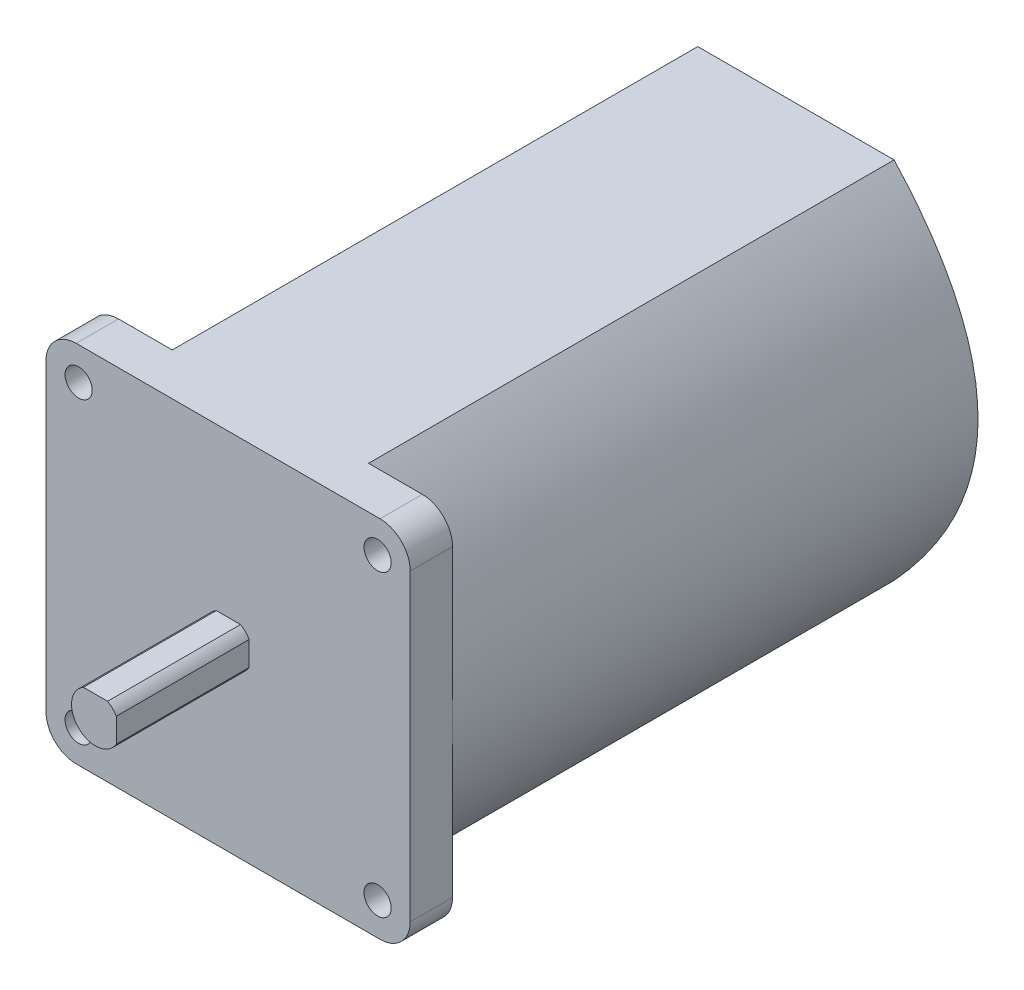
ISO-10303-21;
HEADER;
FILE_DESCRIPTION(('STEP AP214'),'2;1');
FILE_NAME('part.step','',(''),(''),'','','');
FILE_SCHEMA(('AUTOMOTIVE_DESIGN { 1 0 10303 214 1 1 1 1 }'));
ENDSEC;
DATA;
#1=APPLICATION_CONTEXT('core data for automotive mechanical design processes');
#2=APPLICATION_PROTOCOL_DEFINITION('international standard','automotive_design',2000,#1);
#3=PRODUCT_CONTEXT('',#1,'mechanical');
#4=PRODUCT('Part','Part','',(#3));
#5=PRODUCT_RELATED_PRODUCT_CATEGORY('part','',(#4));
#6=PRODUCT_DEFINITION_FORMATION('','',#4);
#7=PRODUCT_DEFINITION_CONTEXT('part definition',#1,'design');
#8=PRODUCT_DEFINITION('design','',#6,#7);
#9=PRODUCT_DEFINITION_SHAPE('','',#8);
#10=(LENGTH_UNIT() NAMED_UNIT(*) SI_UNIT(.MILLI.,.METRE.));
#11=(NAMED_UNIT(*) PLANE_ANGLE_UNIT() SI_UNIT($,.RADIAN.));
#12=(NAMED_UNIT(*) SI_UNIT($,.STERADIAN.) SOLID_ANGLE_UNIT());
#13=UNCERTAINTY_MEASURE_WITH_UNIT(LENGTH_MEASURE(1.E-05),#10,'distance_accuracy_value','');
#14=(GEOMETRIC_REPRESENTATION_CONTEXT(3) GLOBAL_UNCERTAINTY_ASSIGNED_CONTEXT((#13)) GLOBAL_UNIT_ASSIGNED_CONTEXT((#10,
#11,#12)) REPRESENTATION_CONTEXT('',''));
#15=CARTESIAN_POINT('',(0.,0.,0.));
#16=DIRECTION('',(0.,0.,1.));
#17=DIRECTION('',(1.,0.,0.));
#18=AXIS2_PLACEMENT_3D('',#15,#16,#17);
#19=CARTESIAN_POINT('',(-8.9,4.99999999999999,94.));
#20=DIRECTION('',(0.,0.,-1.));
#21=DIRECTION('',(-1.,0.,0.));
#22=AXIS2_PLACEMENT_3D('',#19,#20,#21);
#23=PLANE('',#22);
#24=CARTESIAN_POINT('',(-8.49873734152981,54.8987373415292,94.));
#25=DIRECTION('',(0.,0.,1.));
#26=DIRECTION('',(1.,0.,0.));
#27=AXIS2_PLACEMENT_3D('',#24,#25,#26);
#28=CIRCLE('',#27,2.24999999999927);
#29=CARTESIAN_POINT('',(-6.24873734153054,54.8987373415292,94.));
#30=VERTEX_POINT('',#29);
#31=EDGE_CURVE('E179',#30,#30,#28,.T.);
#32=ORIENTED_EDGE('',*,*,#31,.F.);
#33=EDGE_LOOP('',(#32));
#34=FACE_BOUND('',#33,.T.);
#35=CARTESIAN_POINT('',(40.9987373415298,5.40126265847079,94.));
#36=DIRECTION('',(0.,0.,1.));
#37=DIRECTION('',(1.,0.,0.));
#38=AXIS2_PLACEMENT_3D('',#35,#36,#37);
#39=CIRCLE('',#38,2.25);
#40=CARTESIAN_POINT('',(43.2487373415298,5.40126265847079,94.));
#41=VERTEX_POINT('',#40);
#42=EDGE_CURVE('E194',#41,#41,#39,.T.);
#43=ORIENTED_EDGE('',*,*,#42,.F.);
#44=EDGE_LOOP('',(#43));
#45=FACE_BOUND('',#44,.T.);
#46=CARTESIAN_POINT('',(-8.9,4.99999999999999,94.));
#47=DIRECTION('',(0.,0.,1.));
#48=DIRECTION('',(-1.,0.,0.));
#49=AXIS2_PLACEMENT_3D('',#46,#47,#48);
#50=CIRCLE('',#49,5.);
#51=CARTESIAN_POINT('',(-13.9,5.00000000000003,94.));
#52=VERTEX_POINT('',#51);
#53=CARTESIAN_POINT('',(-8.89999999999996,0.,94.));
#54=VERTEX_POINT('',#53);
#55=EDGE_CURVE('E206',#52,#54,#50,.T.);
#56=ORIENTED_EDGE('',*,*,#55,.T.);
#57=DIRECTION('',(1.,0.,0.));
#58=VECTOR('',#57,1.);
#59=CARTESIAN_POINT('',(41.4,0.,94.));
#60=LINE('',#59,#58);
#61=CARTESIAN_POINT('',(41.4,0.,94.));
#62=VERTEX_POINT('',#61);
#63=EDGE_CURVE('E209',#54,#62,#60,.T.);
#64=ORIENTED_EDGE('',*,*,#63,.T.);
#65=CARTESIAN_POINT('',(41.4,5.,94.));
#66=DIRECTION('',(0.,0.,1.));
#67=DIRECTION('',(-1.,0.,0.));
#68=AXIS2_PLACEMENT_3D('',#65,#66,#67);
#69=CIRCLE('',#68,5.);
#70=CARTESIAN_POINT('',(46.4,5.00000000000004,94.));
#71=VERTEX_POINT('',#70);
#72=EDGE_CURVE('E212',#62,#71,#69,.T.);
#73=ORIENTED_EDGE('',*,*,#72,.T.);
#74=DIRECTION('',(0.,1.,0.));
#75=VECTOR('',#74,1.);
#76=CARTESIAN_POINT('',(46.4,55.2999999999998,94.));
#77=LINE('',#76,#75);
#78=CARTESIAN_POINT('',(46.4,55.2999999999998,94.));
#79=VERTEX_POINT('',#78);
#80=EDGE_CURVE('E214',#71,#79,#77,.T.);
#81=ORIENTED_EDGE('',*,*,#80,.T.);
#82=CARTESIAN_POINT('',(41.4,55.2999999999999,94.));
#83=DIRECTION('',(0.,0.,1.));
#84=DIRECTION('',(-1.,0.,0.));
#85=AXIS2_PLACEMENT_3D('',#82,#83,#84);
#86=CIRCLE('',#85,5.);
#87=CARTESIAN_POINT('',(41.3999999999999,60.2999999999999,94.));
#88=VERTEX_POINT('',#87);
#89=EDGE_CURVE('E216',#79,#88,#86,.T.);
#90=ORIENTED_EDGE('',*,*,#89,.T.);
#91=DIRECTION('',(-1.,0.,0.));
#92=VECTOR('',#91,1.);
#93=CARTESIAN_POINT('',(-8.89999999999997,60.2999999999999,94.));
#94=LINE('',#93,#92);
#95=CARTESIAN_POINT('',(-8.89999999999997,60.2999999999999,94.));
#96=VERTEX_POINT('',#95);
#97=EDGE_CURVE('E218',#88,#96,#94,.T.);
#98=ORIENTED_EDGE('',*,*,#97,.T.);
#99=CARTESIAN_POINT('',(-8.90000000000001,55.2999999999999,94.));
#100=DIRECTION('',(0.,0.,1.));
#101=DIRECTION('',(-1.,0.,0.));
#102=AXIS2_PLACEMENT_3D('',#99,#100,#101);
#103=CIRCLE('',#102,5.);
#104=CARTESIAN_POINT('',(-13.9,55.2999999999998,94.));
#105=VERTEX_POINT('',#104);
#106=EDGE_CURVE('E220',#96,#105,#103,.T.);
#107=ORIENTED_EDGE('',*,*,#106,.T.);
#108=DIRECTION('',(0.,-1.,0.));
#109=VECTOR('',#108,1.);
#110=CARTESIAN_POINT('',(-13.9,55.2999999999998,94.));
#111=LINE('',#110,#109);
#112=EDGE_CURVE('E222',#105,#52,#111,.T.);
#113=ORIENTED_EDGE('',*,*,#112,.T.);
#114=EDGE_LOOP('',(#56,#64,#73,#81,#90,#98,#107,#113));
#115=FACE_BOUND('',#114,.T.);
#116=CARTESIAN_POINT('',(40.9987373415291,54.8987373415292,94.));
#117=DIRECTION('',(0.,0.,1.));
#118=DIRECTION('',(1.,0.,0.));
#119=AXIS2_PLACEMENT_3D('',#116,#117,#118);
#120=CIRCLE('',#119,2.25);
#121=CARTESIAN_POINT('',(43.2487373415291,54.8987373415292,94.));
#122=VERTEX_POINT('',#121);
#123=EDGE_CURVE('E200',#122,#122,#120,.T.);
#124=ORIENTED_EDGE('',*,*,#123,.F.);
#125=EDGE_LOOP('',(#124));
#126=FACE_BOUND('',#125,.T.);
#127=CARTESIAN_POINT('',(-8.4987373415286,5.40126265847027,94.));
#128=DIRECTION('',(0.,0.,1.));
#129=DIRECTION('',(1.,0.,0.));
#130=AXIS2_PLACEMENT_3D('',#127,#128,#129);
#131=CIRCLE('',#130,2.25000000000001);
#132=CARTESIAN_POINT('',(-6.2487373415286,5.40126265847027,94.));
#133=VERTEX_POINT('',#132);
#134=EDGE_CURVE('E188',#133,#133,#131,.T.);
#135=ORIENTED_EDGE('',*,*,#134,.F.);
#136=EDGE_LOOP('',(#135));
#137=FACE_BOUND('',#136,.T.);
#138=CARTESIAN_POINT('',(16.3001335088736,30.15,94.));
#139=DIRECTION('',(0.,0.,1.));
#140=DIRECTION('',(-1.,0.,0.));
#141=AXIS2_PLACEMENT_3D('',#138,#139,#140);
#142=CIRCLE('',#141,3.9749999999999);
#143=CARTESIAN_POINT('',(19.7353372873996,32.1499999999999,94.));
#144=VERTEX_POINT('',#143);
#145=CARTESIAN_POINT('',(18.3001335088735,33.585203778526,94.));
#146=VERTEX_POINT('',#145);
#147=EDGE_CURVE('E175',#144,#146,#142,.T.);
#148=ORIENTED_EDGE('',*,*,#147,.F.);
#149=DIRECTION('',(0.,1.,0.));
#150=VECTOR('',#149,1.);
#151=CARTESIAN_POINT('',(19.7353372873996,32.1499999999999,94.));
#152=LINE('',#151,#150);
#153=CARTESIAN_POINT('',(19.7353372873996,28.1499999999999,94.));
#154=VERTEX_POINT('',#153);
#155=EDGE_CURVE('E172',#154,#144,#152,.T.);
#156=ORIENTED_EDGE('',*,*,#155,.F.);
#157=CARTESIAN_POINT('',(16.3001335088735,30.1499999999999,94.));
#158=DIRECTION('',(0.,0.,1.));
#159=DIRECTION('',(1.,0.,0.));
#160=AXIS2_PLACEMENT_3D('',#157,#158,#159);
#161=CIRCLE('',#160,3.975);
#162=CARTESIAN_POINT('',(14.3001335088735,33.585203778526,94.));
#163=VERTEX_POINT('',#162);
#164=EDGE_CURVE('E56',#163,#154,#161,.T.);
#165=ORIENTED_EDGE('',*,*,#164,.F.);
#166=DIRECTION('',(-1.,0.,0.));
#167=VECTOR('',#166,1.);
#168=CARTESIAN_POINT('',(18.3001335088735,33.585203778526,94.));
#169=LINE('',#168,#167);
#170=EDGE_CURVE('E51',#146,#163,#169,.T.);
#171=ORIENTED_EDGE('',*,*,#170,.F.);
#172=EDGE_LOOP('',(#148,#156,#165,#171));
#173=FACE_BOUND('',#172,.T.);
#174=ADVANCED_FACE('F33',(#34,#45,#115,#126,#137,#173),#23,.F.);
#175=CARTESIAN_POINT('',(0.,60.3,87.));
#176=CARTESIAN_POINT('',(-27.8,30.15,87.));
#177=CARTESIAN_POINT('',(0.,0.,87.));
#178=B_SPLINE_CURVE_WITH_KNOTS('',2,(#175,#176,#177),.UNSPECIFIED.,.F.,.F.,(3,3),(0.,1.),.UNSPECIFIED.);
#179=DIRECTION('',(0.,0.,-1.));
#180=VECTOR('',#179,1.);
#181=SURFACE_OF_LINEAR_EXTRUSION('',#178,#180);
#182=CARTESIAN_POINT('',(0.,60.3,0.));
#183=CARTESIAN_POINT('',(-27.8,30.15,0.));
#184=CARTESIAN_POINT('',(0.,0.,0.));
#185=B_SPLINE_CURVE_WITH_KNOTS('',2,(#182,#183,#184),.UNSPECIFIED.,.F.,.F.,(3,3),(0.,1.),.UNSPECIFIED.);
#186=CARTESIAN_POINT('',(0.,60.3,0.));
#187=VERTEX_POINT('',#186);
#188=CARTESIAN_POINT('',(0.,0.,0.));
#189=VERTEX_POINT('',#188);
#190=EDGE_CURVE('E274',#187,#189,#185,.T.);
#191=ORIENTED_EDGE('',*,*,#190,.T.);
#192=DIRECTION('',(0.,0.,-1.));
#193=VECTOR('',#192,1.);
#194=CARTESIAN_POINT('',(0.,0.,87.));
#195=LINE('',#194,#193);
#196=CARTESIAN_POINT('',(0.,0.,87.));
#197=VERTEX_POINT('',#196);
#198=EDGE_CURVE('E11',#197,#189,#195,.T.);
#199=ORIENTED_EDGE('',*,*,#198,.F.);
#200=CARTESIAN_POINT('',(-13.9,30.149999999998,87.));
#201=VERTEX_POINT('',#200);
#202=EDGE_CURVE('E303',#201,#197,#178,.T.);
#203=ORIENTED_EDGE('',*,*,#202,.F.);
#204=CARTESIAN_POINT('',(0.,60.3,87.));
#205=VERTEX_POINT('',#204);
#206=EDGE_CURVE('E38',#205,#201,#178,.T.);
#207=ORIENTED_EDGE('',*,*,#206,.F.);
#208=DIRECTION('',(0.,0.,-1.));
#209=VECTOR('',#208,1.);
#210=CARTESIAN_POINT('',(0.,60.3,87.));
#211=LINE('',#210,#209);
#212=EDGE_CURVE('E307',#205,#187,#211,.T.);
#213=ORIENTED_EDGE('',*,*,#212,.T.);
#214=EDGE_LOOP('',(#191,#199,#203,#207,#213));
#215=FACE_BOUND('',#214,.T.);
#216=ADVANCED_FACE('F35',(#215),#181,.F.);
#217=CARTESIAN_POINT('',(0.,0.,87.));
#218=DIRECTION('',(0.,1.,0.));
#219=DIRECTION('',(0.,0.,1.));
#220=AXIS2_PLACEMENT_3D('',#217,#218,#219);
#221=PLANE('',#220);
#222=DIRECTION('',(1.,0.,0.));
#223=VECTOR('',#222,1.);
#224=CARTESIAN_POINT('',(0.,0.,0.));
#225=LINE('',#224,#223);
#226=CARTESIAN_POINT('',(32.5,0.,0.));
#227=VERTEX_POINT('',#226);
#228=EDGE_CURVE('E278',#189,#227,#225,.T.);
#229=ORIENTED_EDGE('',*,*,#228,.T.);
#230=DIRECTION('',(0.,0.,-1.));
#231=VECTOR('',#230,1.);
#232=CARTESIAN_POINT('',(32.5,0.,87.));
#233=LINE('',#232,#231);
#234=CARTESIAN_POINT('',(32.5,0.,87.));
#235=VERTEX_POINT('',#234);
#236=EDGE_CURVE('E43',#235,#227,#233,.T.);
#237=ORIENTED_EDGE('',*,*,#236,.F.);
#238=DIRECTION('',(1.,0.,0.));
#239=VECTOR('',#238,1.);
#240=CARTESIAN_POINT('',(41.4,0.,87.));
#241=LINE('',#240,#239);
#242=CARTESIAN_POINT('',(41.4,0.,87.));
#243=VERTEX_POINT('',#242);
#244=EDGE_CURVE('E227',#235,#243,#241,.T.);
#245=ORIENTED_EDGE('',*,*,#244,.T.);
#246=DIRECTION('',(0.,0.,-1.));
#247=VECTOR('',#246,1.);
#248=CARTESIAN_POINT('',(41.4,0.,94.));
#249=LINE('',#248,#247);
#250=EDGE_CURVE('E270',#62,#243,#249,.T.);
#251=ORIENTED_EDGE('',*,*,#250,.F.);
#252=ORIENTED_EDGE('',*,*,#63,.F.);
#253=DIRECTION('',(0.,0.,-1.));
#254=VECTOR('',#253,1.);
#255=CARTESIAN_POINT('',(-8.89999999999996,0.,94.));
#256=LINE('',#255,#254);
#257=CARTESIAN_POINT('',(-8.89999999999996,0.,87.));
#258=VERTEX_POINT('',#257);
#259=EDGE_CURVE('E272',#54,#258,#256,.T.);
#260=ORIENTED_EDGE('',*,*,#259,.T.);
#261=EDGE_CURVE('E235',#258,#197,#241,.T.);
#262=ORIENTED_EDGE('',*,*,#261,.T.);
#263=ORIENTED_EDGE('',*,*,#198,.T.);
#264=EDGE_LOOP('',(#229,#237,#245,#251,#252,#260,#262,#263));
#265=FACE_BOUND('',#264,.T.);
#266=ADVANCED_FACE('F341',(#265),#221,.F.);
#267=CARTESIAN_POINT('',(32.5,0.,87.));
#268=CARTESIAN_POINT('',(60.3,30.15,87.));
#269=CARTESIAN_POINT('',(32.5,60.3,87.));
#270=B_SPLINE_CURVE_WITH_KNOTS('',2,(#267,#268,#269),.UNSPECIFIED.,.F.,.F.,(3,3),(0.,1.),.UNSPECIFIED.);
#271=DIRECTION('',(0.,0.,-1.));
#272=VECTOR('',#271,1.);
#273=SURFACE_OF_LINEAR_EXTRUSION('',#270,#272);
#274=CARTESIAN_POINT('',(32.5,0.,0.));
#275=CARTESIAN_POINT('',(60.3,30.15,0.));
#276=CARTESIAN_POINT('',(32.5,60.3,0.));
#277=B_SPLINE_CURVE_WITH_KNOTS('',2,(#274,#275,#276),.UNSPECIFIED.,.F.,.F.,(3,3),(0.,1.),.UNSPECIFIED.);
#278=CARTESIAN_POINT('',(32.5,60.3,0.));
#279=VERTEX_POINT('',#278);
#280=EDGE_CURVE('E283',#227,#279,#277,.T.);
#281=ORIENTED_EDGE('',*,*,#280,.T.);
#282=DIRECTION('',(0.,0.,-1.));
#283=VECTOR('',#282,1.);
#284=CARTESIAN_POINT('',(32.5,60.3,87.));
#285=LINE('',#284,#283);
#286=CARTESIAN_POINT('',(32.5,60.2999999999999,87.));
#287=VERTEX_POINT('',#286);
#288=EDGE_CURVE('E304',#287,#279,#285,.T.);
#289=ORIENTED_EDGE('',*,*,#288,.F.);
#290=CARTESIAN_POINT('',(46.4,30.1500000000092,87.));
#291=VERTEX_POINT('',#290);
#292=EDGE_CURVE('E310',#291,#287,#270,.T.);
#293=ORIENTED_EDGE('',*,*,#292,.F.);
#294=EDGE_CURVE('E313',#235,#291,#270,.T.);
#295=ORIENTED_EDGE('',*,*,#294,.F.);
#296=ORIENTED_EDGE('',*,*,#236,.T.);
#297=EDGE_LOOP('',(#281,#289,#293,#295,#296));
#298=FACE_BOUND('',#297,.T.);
#299=ADVANCED_FACE('F376',(#298),#273,.F.);
#300=CARTESIAN_POINT('',(0.,60.3,87.));
#301=DIRECTION('',(0.,-1.,0.));
#302=DIRECTION('',(0.,0.,-1.));
#303=AXIS2_PLACEMENT_3D('',#300,#301,#302);
#304=PLANE('',#303);
#305=DIRECTION('',(-1.,0.,0.));
#306=VECTOR('',#305,1.);
#307=CARTESIAN_POINT('',(0.,60.3,0.));
#308=LINE('',#307,#306);
#309=EDGE_CURVE('E298',#279,#187,#308,.T.);
#310=ORIENTED_EDGE('',*,*,#309,.T.);
#311=ORIENTED_EDGE('',*,*,#212,.F.);
#312=DIRECTION('',(-1.,0.,0.));
#313=VECTOR('',#312,1.);
#314=CARTESIAN_POINT('',(-8.89999999999997,60.2999999999999,87.));
#315=LINE('',#314,#313);
#316=CARTESIAN_POINT('',(-8.89999999999997,60.2999999999999,87.));
#317=VERTEX_POINT('',#316);
#318=EDGE_CURVE('E238',#205,#317,#315,.T.);
#319=ORIENTED_EDGE('',*,*,#318,.T.);
#320=DIRECTION('',(0.,0.,-1.));
#321=VECTOR('',#320,1.);
#322=CARTESIAN_POINT('',(-8.89999999999997,60.2999999999999,94.));
#323=LINE('',#322,#321);
#324=EDGE_CURVE('E258',#96,#317,#323,.T.);
#325=ORIENTED_EDGE('',*,*,#324,.F.);
#326=ORIENTED_EDGE('',*,*,#97,.F.);
#327=DIRECTION('',(0.,0.,-1.));
#328=VECTOR('',#327,1.);
#329=CARTESIAN_POINT('',(41.3999999999999,60.2999999999999,94.));
#330=LINE('',#329,#328);
#331=CARTESIAN_POINT('',(41.3999999999999,60.2999999999999,87.));
#332=VERTEX_POINT('',#331);
#333=EDGE_CURVE('E261',#88,#332,#330,.T.);
#334=ORIENTED_EDGE('',*,*,#333,.T.);
#335=EDGE_CURVE('E241',#332,#287,#315,.T.);
#336=ORIENTED_EDGE('',*,*,#335,.T.);
#337=ORIENTED_EDGE('',*,*,#288,.T.);
#338=EDGE_LOOP('',(#310,#311,#319,#325,#326,#334,#336,#337));
#339=FACE_BOUND('',#338,.T.);
#340=ADVANCED_FACE('F356',(#339),#304,.F.);
#341=CARTESIAN_POINT('',(-13.9,30.15,0.));
#342=DIRECTION('',(0.,0.,-1.));
#343=DIRECTION('',(-1.,0.,0.));
#344=AXIS2_PLACEMENT_3D('',#341,#342,#343);
#345=PLANE('',#344);
#346=ORIENTED_EDGE('',*,*,#190,.F.);
#347=ORIENTED_EDGE('',*,*,#309,.F.);
#348=ORIENTED_EDGE('',*,*,#280,.F.);
#349=ORIENTED_EDGE('',*,*,#228,.F.);
#350=EDGE_LOOP('',(#346,#347,#348,#349));
#351=FACE_BOUND('',#350,.T.);
#352=ADVANCED_FACE('F339',(#351),#345,.T.);
#353=CARTESIAN_POINT('',(-8.9,4.99999999999999,87.));
#354=DIRECTION('',(0.,0.,-1.));
#355=DIRECTION('',(-1.,0.,0.));
#356=AXIS2_PLACEMENT_3D('',#353,#354,#355);
#357=PLANE('',#356);
#358=CARTESIAN_POINT('',(-8.49873734152981,54.8987373415292,87.));
#359=DIRECTION('',(0.,0.,1.));
#360=DIRECTION('',(1.,0.,0.));
#361=AXIS2_PLACEMENT_3D('',#358,#359,#360);
#362=CIRCLE('',#361,2.24999999999927);
#363=CARTESIAN_POINT('',(-6.24873734153054,54.8987373415292,87.));
#364=VERTEX_POINT('',#363);
#365=EDGE_CURVE('E176',#364,#364,#362,.T.);
#366=ORIENTED_EDGE('',*,*,#365,.T.);
#367=EDGE_LOOP('',(#366));
#368=FACE_BOUND('',#367,.T.);
#369=ORIENTED_EDGE('',*,*,#318,.F.);
#370=ORIENTED_EDGE('',*,*,#206,.T.);
#371=DIRECTION('',(0.,-1.,0.));
#372=VECTOR('',#371,1.);
#373=CARTESIAN_POINT('',(-13.9,55.2999999999998,87.));
#374=LINE('',#373,#372);
#375=CARTESIAN_POINT('',(-13.9,55.2999999999998,87.));
#376=VERTEX_POINT('',#375);
#377=EDGE_CURVE('E210',#376,#201,#374,.T.);
#378=ORIENTED_EDGE('',*,*,#377,.F.);
#379=CARTESIAN_POINT('',(-8.90000000000001,55.2999999999999,87.));
#380=DIRECTION('',(0.,0.,1.));
#381=DIRECTION('',(-1.,0.,0.));
#382=AXIS2_PLACEMENT_3D('',#379,#380,#381);
#383=CIRCLE('',#382,5.);
#384=EDGE_CURVE('E247',#317,#376,#383,.T.);
#385=ORIENTED_EDGE('',*,*,#384,.F.);
#386=EDGE_LOOP('',(#369,#370,#378,#385));
#387=FACE_BOUND('',#386,.T.);
#388=ADVANCED_FACE('F354',(#368,#387),#357,.T.);
#389=CARTESIAN_POINT('',(-8.4987373415286,5.40126265847027,87.));
#390=DIRECTION('',(0.,0.,1.));
#391=DIRECTION('',(1.,0.,0.));
#392=AXIS2_PLACEMENT_3D('',#389,#390,#391);
#393=CIRCLE('',#392,2.25000000000001);
#394=CARTESIAN_POINT('',(-6.2487373415286,5.40126265847027,87.));
#395=VERTEX_POINT('',#394);
#396=EDGE_CURVE('E186',#395,#395,#393,.T.);
#397=ORIENTED_EDGE('',*,*,#396,.T.);
#398=EDGE_LOOP('',(#397));
#399=FACE_BOUND('',#398,.T.);
#400=CARTESIAN_POINT('',(-13.9,5.00000000000003,87.));
#401=VERTEX_POINT('',#400);
#402=EDGE_CURVE('E250',#201,#401,#374,.T.);
#403=ORIENTED_EDGE('',*,*,#402,.F.);
#404=ORIENTED_EDGE('',*,*,#202,.T.);
#405=ORIENTED_EDGE('',*,*,#261,.F.);
#406=CARTESIAN_POINT('',(-8.9,4.99999999999999,87.));
#407=DIRECTION('',(0.,0.,1.));
#408=DIRECTION('',(-1.,0.,0.));
#409=AXIS2_PLACEMENT_3D('',#406,#407,#408);
#410=CIRCLE('',#409,5.);
#411=EDGE_CURVE('E203',#401,#258,#410,.T.);
#412=ORIENTED_EDGE('',*,*,#411,.F.);
#413=EDGE_LOOP('',(#403,#404,#405,#412));
#414=FACE_BOUND('',#413,.T.);
#415=ADVANCED_FACE('F344',(#399,#414),#357,.T.);
#416=CARTESIAN_POINT('',(40.9987373415298,5.40126265847079,87.));
#417=DIRECTION('',(0.,0.,1.));
#418=DIRECTION('',(1.,0.,0.));
#419=AXIS2_PLACEMENT_3D('',#416,#417,#418);
#420=CIRCLE('',#419,2.25);
#421=CARTESIAN_POINT('',(43.2487373415298,5.40126265847079,87.));
#422=VERTEX_POINT('',#421);
#423=EDGE_CURVE('E191',#422,#422,#420,.T.);
#424=ORIENTED_EDGE('',*,*,#423,.T.);
#425=EDGE_LOOP('',(#424));
#426=FACE_BOUND('',#425,.T.);
#427=ORIENTED_EDGE('',*,*,#244,.F.);
#428=ORIENTED_EDGE('',*,*,#294,.T.);
#429=DIRECTION('',(0.,1.,0.));
#430=VECTOR('',#429,1.);
#431=CARTESIAN_POINT('',(46.4,55.2999999999998,87.));
#432=LINE('',#431,#430);
#433=CARTESIAN_POINT('',(46.4,5.00000000000004,87.));
#434=VERTEX_POINT('',#433);
#435=EDGE_CURVE('E382',#434,#291,#432,.T.);
#436=ORIENTED_EDGE('',*,*,#435,.F.);
#437=CARTESIAN_POINT('',(41.4,5.,87.));
#438=DIRECTION('',(0.,0.,1.));
#439=DIRECTION('',(-1.,0.,0.));
#440=AXIS2_PLACEMENT_3D('',#437,#438,#439);
#441=CIRCLE('',#440,5.);
#442=EDGE_CURVE('E230',#243,#434,#441,.T.);
#443=ORIENTED_EDGE('',*,*,#442,.F.);
#444=EDGE_LOOP('',(#427,#428,#436,#443));
#445=FACE_BOUND('',#444,.T.);
#446=ADVANCED_FACE('F380',(#426,#445),#357,.T.);
#447=CARTESIAN_POINT('',(40.9987373415291,54.8987373415292,87.));
#448=DIRECTION('',(0.,0.,1.));
#449=DIRECTION('',(1.,0.,0.));
#450=AXIS2_PLACEMENT_3D('',#447,#448,#449);
#451=CIRCLE('',#450,2.25);
#452=CARTESIAN_POINT('',(43.2487373415291,54.8987373415292,87.));
#453=VERTEX_POINT('',#452);
#454=EDGE_CURVE('E197',#453,#453,#451,.T.);
#455=ORIENTED_EDGE('',*,*,#454,.T.);
#456=EDGE_LOOP('',(#455));
#457=FACE_BOUND('',#456,.T.);
#458=CARTESIAN_POINT('',(46.4,55.2999999999998,87.));
#459=VERTEX_POINT('',#458);
#460=EDGE_CURVE('E372',#291,#459,#432,.T.);
#461=ORIENTED_EDGE('',*,*,#460,.F.);
#462=ORIENTED_EDGE('',*,*,#292,.T.);
#463=ORIENTED_EDGE('',*,*,#335,.F.);
#464=CARTESIAN_POINT('',(41.4,55.2999999999999,87.));
#465=DIRECTION('',(0.,0.,1.));
#466=DIRECTION('',(-1.,0.,0.));
#467=AXIS2_PLACEMENT_3D('',#464,#465,#466);
#468=CIRCLE('',#467,5.);
#469=EDGE_CURVE('E242',#459,#332,#468,.T.);
#470=ORIENTED_EDGE('',*,*,#469,.F.);
#471=EDGE_LOOP('',(#461,#462,#463,#470));
#472=FACE_BOUND('',#471,.T.);
#473=ADVANCED_FACE('F371',(#457,#472),#357,.T.);
#474=CARTESIAN_POINT('',(-8.9,4.99999999999999,94.));
#475=DIRECTION('',(0.,0.,-1.));
#476=DIRECTION('',(-1.,0.,0.));
#477=AXIS2_PLACEMENT_3D('',#474,#475,#476);
#478=CYLINDRICAL_SURFACE('',#477,5.);
#479=ORIENTED_EDGE('',*,*,#411,.T.);
#480=ORIENTED_EDGE('',*,*,#259,.F.);
#481=ORIENTED_EDGE('',*,*,#55,.F.);
#482=DIRECTION('',(0.,0.,-1.));
#483=VECTOR('',#482,1.);
#484=CARTESIAN_POINT('',(-13.9,5.00000000000003,94.));
#485=LINE('',#484,#483);
#486=EDGE_CURVE('E224',#52,#401,#485,.T.);
#487=ORIENTED_EDGE('',*,*,#486,.T.);
#488=EDGE_LOOP('',(#479,#480,#481,#487));
#489=FACE_BOUND('',#488,.T.);
#490=ADVANCED_FACE('F392',(#489),#478,.T.);
#491=CARTESIAN_POINT('',(41.4,5.,94.));
#492=DIRECTION('',(0.,0.,-1.));
#493=DIRECTION('',(-1.,0.,0.));
#494=AXIS2_PLACEMENT_3D('',#491,#492,#493);
#495=CYLINDRICAL_SURFACE('',#494,5.);
#496=ORIENTED_EDGE('',*,*,#442,.T.);
#497=DIRECTION('',(0.,0.,-1.));
#498=VECTOR('',#497,1.);
#499=CARTESIAN_POINT('',(46.4,5.00000000000004,94.));
#500=LINE('',#499,#498);
#501=EDGE_CURVE('E267',#71,#434,#500,.T.);
#502=ORIENTED_EDGE('',*,*,#501,.F.);
#503=ORIENTED_EDGE('',*,*,#72,.F.);
#504=ORIENTED_EDGE('',*,*,#250,.T.);
#505=EDGE_LOOP('',(#496,#502,#503,#504));
#506=FACE_BOUND('',#505,.T.);
#507=ADVANCED_FACE('F386',(#506),#495,.T.);
#508=CARTESIAN_POINT('',(46.4,55.2999999999998,94.));
#509=DIRECTION('',(-1.,0.,0.));
#510=DIRECTION('',(0.,-1.,0.));
#511=AXIS2_PLACEMENT_3D('',#508,#509,#510);
#512=PLANE('',#511);
#513=ORIENTED_EDGE('',*,*,#435,.T.);
#514=ORIENTED_EDGE('',*,*,#460,.T.);
#515=DIRECTION('',(0.,0.,-1.));
#516=VECTOR('',#515,1.);
#517=CARTESIAN_POINT('',(46.4,55.2999999999998,94.));
#518=LINE('',#517,#516);
#519=EDGE_CURVE('E264',#79,#459,#518,.T.);
#520=ORIENTED_EDGE('',*,*,#519,.F.);
#521=ORIENTED_EDGE('',*,*,#80,.F.);
#522=ORIENTED_EDGE('',*,*,#501,.T.);
#523=EDGE_LOOP('',(#513,#514,#520,#521,#522));
#524=FACE_BOUND('',#523,.T.);
#525=ADVANCED_FACE('F399',(#524),#512,.F.);
#526=CARTESIAN_POINT('',(41.4,55.2999999999999,94.));
#527=DIRECTION('',(0.,0.,-1.));
#528=DIRECTION('',(-1.,0.,0.));
#529=AXIS2_PLACEMENT_3D('',#526,#527,#528);
#530=CYLINDRICAL_SURFACE('',#529,5.);
#531=ORIENTED_EDGE('',*,*,#469,.T.);
#532=ORIENTED_EDGE('',*,*,#333,.F.);
#533=ORIENTED_EDGE('',*,*,#89,.F.);
#534=ORIENTED_EDGE('',*,*,#519,.T.);
#535=EDGE_LOOP('',(#531,#532,#533,#534));
#536=FACE_BOUND('',#535,.T.);
#537=ADVANCED_FACE('F420',(#536),#530,.T.);
#538=CARTESIAN_POINT('',(-8.90000000000001,55.2999999999999,94.));
#539=DIRECTION('',(0.,0.,-1.));
#540=DIRECTION('',(-1.,0.,0.));
#541=AXIS2_PLACEMENT_3D('',#538,#539,#540);
#542=CYLINDRICAL_SURFACE('',#541,5.);
#543=ORIENTED_EDGE('',*,*,#384,.T.);
#544=DIRECTION('',(0.,0.,-1.));
#545=VECTOR('',#544,1.);
#546=CARTESIAN_POINT('',(-13.9,55.2999999999998,94.));
#547=LINE('',#546,#545);
#548=EDGE_CURVE('E255',#105,#376,#547,.T.);
#549=ORIENTED_EDGE('',*,*,#548,.F.);
#550=ORIENTED_EDGE('',*,*,#106,.F.);
#551=ORIENTED_EDGE('',*,*,#324,.T.);
#552=EDGE_LOOP('',(#543,#549,#550,#551));
#553=FACE_BOUND('',#552,.T.);
#554=ADVANCED_FACE('F360',(#553),#542,.T.);
#555=CARTESIAN_POINT('',(-13.9,55.2999999999998,94.));
#556=DIRECTION('',(1.,0.,0.));
#557=DIRECTION('',(0.,1.,0.));
#558=AXIS2_PLACEMENT_3D('',#555,#556,#557);
#559=PLANE('',#558);
#560=ORIENTED_EDGE('',*,*,#377,.T.);
#561=ORIENTED_EDGE('',*,*,#402,.T.);
#562=ORIENTED_EDGE('',*,*,#486,.F.);
#563=ORIENTED_EDGE('',*,*,#112,.F.);
#564=ORIENTED_EDGE('',*,*,#548,.T.);
#565=EDGE_LOOP('',(#560,#561,#562,#563,#564));
#566=FACE_BOUND('',#565,.T.);
#567=ADVANCED_FACE('F349',(#566),#559,.F.);
#568=CARTESIAN_POINT('',(40.9987373415291,54.8987373415292,94.));
#569=DIRECTION('',(0.,0.,-1.));
#570=DIRECTION('',(-1.,0.,0.));
#571=AXIS2_PLACEMENT_3D('',#568,#569,#570);
#572=CYLINDRICAL_SURFACE('',#571,2.25);
#573=ORIENTED_EDGE('',*,*,#123,.T.);
#574=EDGE_LOOP('',(#573));
#575=FACE_BOUND('',#574,.T.);
#576=ORIENTED_EDGE('',*,*,#454,.F.);
#577=EDGE_LOOP('',(#576));
#578=FACE_BOUND('',#577,.T.);
#579=ADVANCED_FACE('F413',(#575,#578),#572,.F.);
#580=CARTESIAN_POINT('',(40.9987373415298,5.40126265847079,94.));
#581=DIRECTION('',(0.,0.,-1.));
#582=DIRECTION('',(-1.,0.,0.));
#583=AXIS2_PLACEMENT_3D('',#580,#581,#582);
#584=CYLINDRICAL_SURFACE('',#583,2.25);
#585=ORIENTED_EDGE('',*,*,#42,.T.);
#586=EDGE_LOOP('',(#585));
#587=FACE_BOUND('',#586,.T.);
#588=ORIENTED_EDGE('',*,*,#423,.F.);
#589=EDGE_LOOP('',(#588));
#590=FACE_BOUND('',#589,.T.);
#591=ADVANCED_FACE('F447',(#587,#590),#584,.F.);
#592=CARTESIAN_POINT('',(-8.4987373415286,5.40126265847027,94.));
#593=DIRECTION('',(0.,0.,-1.));
#594=DIRECTION('',(-1.,0.,0.));
#595=AXIS2_PLACEMENT_3D('',#592,#593,#594);
#596=CYLINDRICAL_SURFACE('',#595,2.25000000000001);
#597=ORIENTED_EDGE('',*,*,#134,.T.);
#598=EDGE_LOOP('',(#597));
#599=FACE_BOUND('',#598,.T.);
#600=ORIENTED_EDGE('',*,*,#396,.F.);
#601=EDGE_LOOP('',(#600));
#602=FACE_BOUND('',#601,.T.);
#603=ADVANCED_FACE('F454',(#599,#602),#596,.F.);
#604=CARTESIAN_POINT('',(-8.49873734152981,54.8987373415292,94.));
#605=DIRECTION('',(0.,0.,-1.));
#606=DIRECTION('',(-1.,0.,0.));
#607=AXIS2_PLACEMENT_3D('',#604,#605,#606);
#608=CYLINDRICAL_SURFACE('',#607,2.24999999999927);
#609=ORIENTED_EDGE('',*,*,#31,.T.);
#610=EDGE_LOOP('',(#609));
#611=FACE_BOUND('',#610,.T.);
#612=ORIENTED_EDGE('',*,*,#365,.F.);
#613=EDGE_LOOP('',(#612));
#614=FACE_BOUND('',#613,.T.);
#615=ADVANCED_FACE('F461',(#611,#614),#608,.F.);
#616=CARTESIAN_POINT('',(16.3001335088736,30.15,116.));
#617=DIRECTION('',(0.,0.,-1.));
#618=DIRECTION('',(-1.,0.,0.));
#619=AXIS2_PLACEMENT_3D('',#616,#617,#618);
#620=CYLINDRICAL_SURFACE('',#619,3.9749999999999);
#621=ORIENTED_EDGE('',*,*,#147,.T.);
#622=DIRECTION('',(0.,0.,-1.));
#623=VECTOR('',#622,1.);
#624=CARTESIAN_POINT('',(18.3001335088735,33.585203778526,116.));
#625=LINE('',#624,#623);
#626=CARTESIAN_POINT('',(18.3001335088735,33.585203778526,116.));
#627=VERTEX_POINT('',#626);
#628=EDGE_CURVE('E156',#627,#146,#625,.T.);
#629=ORIENTED_EDGE('',*,*,#628,.F.);
#630=CARTESIAN_POINT('',(16.3001335088736,30.15,116.));
#631=DIRECTION('',(0.,0.,1.));
#632=DIRECTION('',(-1.,0.,0.));
#633=AXIS2_PLACEMENT_3D('',#630,#631,#632);
#634=CIRCLE('',#633,3.9749999999999);
#635=CARTESIAN_POINT('',(19.7353372873996,32.1499999999999,116.));
#636=VERTEX_POINT('',#635);
#637=EDGE_CURVE('E163',#636,#627,#634,.T.);
#638=ORIENTED_EDGE('',*,*,#637,.F.);
#639=DIRECTION('',(0.,0.,-1.));
#640=VECTOR('',#639,1.);
#641=CARTESIAN_POINT('',(19.7353372873996,32.1499999999999,116.));
#642=LINE('',#641,#640);
#643=EDGE_CURVE('E624',#636,#144,#642,.T.);
#644=ORIENTED_EDGE('',*,*,#643,.T.);
#645=EDGE_LOOP('',(#621,#629,#638,#644));
#646=FACE_BOUND('',#645,.T.);
#647=ADVANCED_FACE('F174',(#646),#620,.T.);
#648=CARTESIAN_POINT('',(18.3001335088735,33.585203778526,116.));
#649=DIRECTION('',(0.,-1.,0.));
#650=DIRECTION('',(0.,0.,-1.));
#651=AXIS2_PLACEMENT_3D('',#648,#649,#650);
#652=PLANE('',#651);
#653=ORIENTED_EDGE('',*,*,#170,.T.);
#654=DIRECTION('',(0.,0.,-1.));
#655=VECTOR('',#654,1.);
#656=CARTESIAN_POINT('',(14.3001335088735,33.585203778526,116.));
#657=LINE('',#656,#655);
#658=CARTESIAN_POINT('',(14.3001335088735,33.585203778526,116.));
#659=VERTEX_POINT('',#658);
#660=EDGE_CURVE('E159',#659,#163,#657,.T.);
#661=ORIENTED_EDGE('',*,*,#660,.F.);
#662=DIRECTION('',(-1.,0.,0.));
#663=VECTOR('',#662,1.);
#664=CARTESIAN_POINT('',(18.3001335088735,33.585203778526,116.));
#665=LINE('',#664,#663);
#666=EDGE_CURVE('E152',#627,#659,#665,.T.);
#667=ORIENTED_EDGE('',*,*,#666,.F.);
#668=ORIENTED_EDGE('',*,*,#628,.T.);
#669=EDGE_LOOP('',(#653,#661,#667,#668));
#670=FACE_BOUND('',#669,.T.);
#671=ADVANCED_FACE('F154',(#670),#652,.F.);
#672=CARTESIAN_POINT('',(16.3001335088735,30.1499999999999,116.));
#673=DIRECTION('',(0.,0.,-1.));
#674=DIRECTION('',(-1.,0.,0.));
#675=AXIS2_PLACEMENT_3D('',#672,#673,#674);
#676=CYLINDRICAL_SURFACE('',#675,3.975);
#677=ORIENTED_EDGE('',*,*,#164,.T.);
#678=DIRECTION('',(0.,0.,-1.));
#679=VECTOR('',#678,1.);
#680=CARTESIAN_POINT('',(19.7353372873996,28.1499999999999,116.));
#681=LINE('',#680,#679);
#682=CARTESIAN_POINT('',(19.7353372873996,28.1499999999999,116.));
#683=VERTEX_POINT('',#682);
#684=EDGE_CURVE('E181',#683,#154,#681,.T.);
#685=ORIENTED_EDGE('',*,*,#684,.F.);
#686=CARTESIAN_POINT('',(16.3001335088735,30.1499999999999,116.));
#687=DIRECTION('',(0.,0.,1.));
#688=DIRECTION('',(1.,0.,0.));
#689=AXIS2_PLACEMENT_3D('',#686,#687,#688);
#690=CIRCLE('',#689,3.975);
#691=EDGE_CURVE('E162',#659,#683,#690,.T.);
#692=ORIENTED_EDGE('',*,*,#691,.F.);
#693=ORIENTED_EDGE('',*,*,#660,.T.);
#694=EDGE_LOOP('',(#677,#685,#692,#693));
#695=FACE_BOUND('',#694,.T.);
#696=ADVANCED_FACE('F482',(#695),#676,.T.);
#697=CARTESIAN_POINT('',(19.7353372873996,32.1499999999999,116.));
#698=DIRECTION('',(-1.,0.,0.));
#699=DIRECTION('',(0.,-1.,0.));
#700=AXIS2_PLACEMENT_3D('',#697,#698,#699);
#701=PLANE('',#700);
#702=ORIENTED_EDGE('',*,*,#155,.T.);
#703=ORIENTED_EDGE('',*,*,#643,.F.);
#704=DIRECTION('',(0.,1.,0.));
#705=VECTOR('',#704,1.);
#706=CARTESIAN_POINT('',(19.7353372873996,32.1499999999999,116.));
#707=LINE('',#706,#705);
#708=EDGE_CURVE('E168',#683,#636,#707,.T.);
#709=ORIENTED_EDGE('',*,*,#708,.F.);
#710=ORIENTED_EDGE('',*,*,#684,.T.);
#711=EDGE_LOOP('',(#702,#703,#709,#710));
#712=FACE_BOUND('',#711,.T.);
#713=ADVANCED_FACE('F489',(#712),#701,.F.);
#714=CARTESIAN_POINT('',(16.3001335088736,30.15,116.));
#715=DIRECTION('',(0.,0.,-1.));
#716=DIRECTION('',(-1.,0.,0.));
#717=AXIS2_PLACEMENT_3D('',#714,#715,#716);
#718=PLANE('',#717);
#719=ORIENTED_EDGE('',*,*,#637,.T.);
#720=ORIENTED_EDGE('',*,*,#666,.T.);
#721=ORIENTED_EDGE('',*,*,#691,.T.);
#722=ORIENTED_EDGE('',*,*,#708,.T.);
#723=EDGE_LOOP('',(#719,#720,#721,#722));
#724=FACE_BOUND('',#723,.T.);
#725=ADVANCED_FACE('F166',(#724),#718,.F.);
#726=CLOSED_SHELL('',(#174,#216,#266,#299,#340,#352,#388,#415,#446,#473,#490,#507,#525,#537,
#554,#567,#579,#591,#603,#615,#647,#671,#696,#713,#725));
#727=MANIFOLD_SOLID_BREP('B2',#726);
#728=ADVANCED_BREP_SHAPE_REPRESENTATION('',(#18,#727),#14);
#729=SHAPE_DEFINITION_REPRESENTATION(#9,#728);
ENDSEC;
END-ISO-10303-21;
